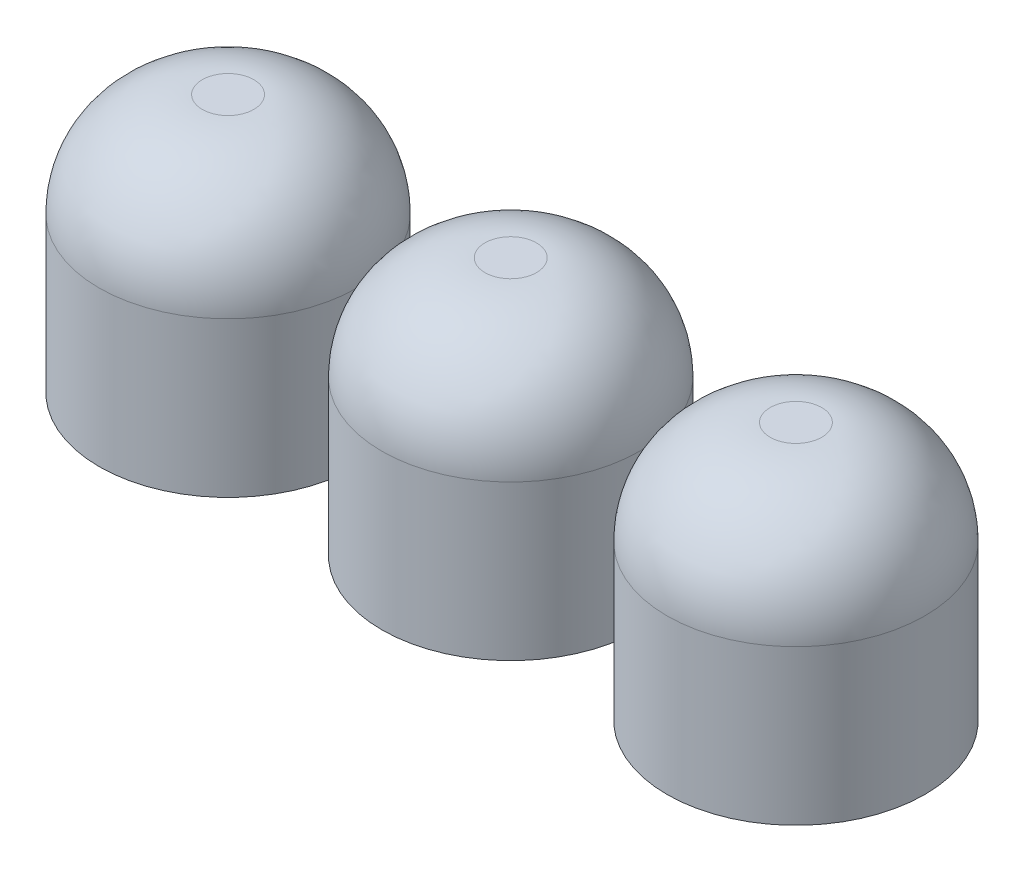
ISO-10303-21;
HEADER;
FILE_DESCRIPTION(('STEP AP214'),'2;1');
FILE_NAME('part.step','',(''),(''),'','','');
FILE_SCHEMA(('AUTOMOTIVE_DESIGN { 1 0 10303 214 1 1 1 1 }'));
ENDSEC;
DATA;
#1=APPLICATION_CONTEXT('core data for automotive mechanical design processes');
#2=APPLICATION_PROTOCOL_DEFINITION('international standard','automotive_design',2000,#1);
#3=PRODUCT_CONTEXT('',#1,'mechanical');
#4=PRODUCT('Part','Part','',(#3));
#5=PRODUCT_RELATED_PRODUCT_CATEGORY('part','',(#4));
#6=PRODUCT_DEFINITION_FORMATION('','',#4);
#7=PRODUCT_DEFINITION_CONTEXT('part definition',#1,'design');
#8=PRODUCT_DEFINITION('design','',#6,#7);
#9=PRODUCT_DEFINITION_SHAPE('','',#8);
#10=(LENGTH_UNIT() NAMED_UNIT(*) SI_UNIT(.MILLI.,.METRE.));
#11=(NAMED_UNIT(*) PLANE_ANGLE_UNIT() SI_UNIT($,.RADIAN.));
#12=(NAMED_UNIT(*) SI_UNIT($,.STERADIAN.) SOLID_ANGLE_UNIT());
#13=UNCERTAINTY_MEASURE_WITH_UNIT(LENGTH_MEASURE(1.E-05),#10,'distance_accuracy_value','');
#14=(GEOMETRIC_REPRESENTATION_CONTEXT(3) GLOBAL_UNCERTAINTY_ASSIGNED_CONTEXT((#13)) GLOBAL_UNIT_ASSIGNED_CONTEXT((#10,
#11,#12)) REPRESENTATION_CONTEXT('',''));
#15=CARTESIAN_POINT('',(0.,0.,0.));
#16=DIRECTION('',(0.,0.,1.));
#17=DIRECTION('',(1.,0.,0.));
#18=AXIS2_PLACEMENT_3D('',#15,#16,#17);
#19=CARTESIAN_POINT('',(-17.3040811056966,5.,-2.43677978773881));
#20=DIRECTION('',(0.,1.,0.));
#21=DIRECTION('',(0.,0.,1.));
#22=AXIS2_PLACEMENT_3D('',#19,#20,#21);
#23=PLANE('',#22);
#24=CARTESIAN_POINT('',(-17.3040811056966,5.,-2.43677978773881));
#25=DIRECTION('',(0.,1.,0.));
#26=DIRECTION('',(0.,0.,1.));
#27=AXIS2_PLACEMENT_3D('',#24,#25,#26);
#28=CIRCLE('',#27,0.5);
#29=CARTESIAN_POINT('',(-17.3040811056966,5.,-1.93677978773881));
#30=VERTEX_POINT('',#29);
#31=EDGE_CURVE('E52',#30,#30,#28,.T.);
#32=ORIENTED_EDGE('',*,*,#31,.T.);
#33=EDGE_LOOP('',(#32));
#34=FACE_BOUND('',#33,.T.);
#35=ADVANCED_FACE('F46',(#34),#23,.T.);
#36=CARTESIAN_POINT('',(-17.3040811056966,0.,-2.43677978773881));
#37=DIRECTION('',(0.,1.,0.));
#38=DIRECTION('',(0.,0.,1.));
#39=AXIS2_PLACEMENT_3D('',#36,#37,#38);
#40=PLANE('',#39);
#41=CARTESIAN_POINT('',(-17.3040811056966,0.,-2.43677978773881));
#42=DIRECTION('',(0.,-1.,0.));
#43=DIRECTION('',(0.,0.,-1.));
#44=AXIS2_PLACEMENT_3D('',#41,#42,#43);
#45=CIRCLE('',#44,2.05);
#46=CARTESIAN_POINT('',(-17.3040811056966,0.,-4.48677978773881));
#47=VERTEX_POINT('',#46);
#48=EDGE_CURVE('E63',#47,#47,#45,.T.);
#49=ORIENTED_EDGE('',*,*,#48,.F.);
#50=EDGE_LOOP('',(#49));
#51=FACE_BOUND('',#50,.T.);
#52=CARTESIAN_POINT('',(-17.3040811056966,0.,-2.43677978773881));
#53=DIRECTION('',(0.,1.,0.));
#54=DIRECTION('',(0.,0.,1.));
#55=AXIS2_PLACEMENT_3D('',#52,#53,#54);
#56=CIRCLE('',#55,2.5);
#57=CARTESIAN_POINT('',(-17.3040811056966,0.,0.0632202122611888));
#58=VERTEX_POINT('',#57);
#59=EDGE_CURVE('E60',#58,#58,#56,.T.);
#60=ORIENTED_EDGE('',*,*,#59,.F.);
#61=EDGE_LOOP('',(#60));
#62=FACE_BOUND('',#61,.T.);
#63=ADVANCED_FACE('F75',(#51,#62),#40,.F.);
#64=CARTESIAN_POINT('',(-17.3040811056966,5.,-2.43677978773881));
#65=DIRECTION('',(0.,-1.,0.));
#66=DIRECTION('',(0.,0.,-1.));
#67=AXIS2_PLACEMENT_3D('',#64,#65,#66);
#68=CYLINDRICAL_SURFACE('',#67,2.5);
#69=CARTESIAN_POINT('',(-17.3040811056966,3.,-2.43677978773881));
#70=DIRECTION('',(0.,1.,0.));
#71=DIRECTION('',(0.,0.,1.));
#72=AXIS2_PLACEMENT_3D('',#69,#70,#71);
#73=CIRCLE('',#72,2.5);
#74=CARTESIAN_POINT('',(-17.3040811056966,3.,0.0632202122611888));
#75=VERTEX_POINT('',#74);
#76=EDGE_CURVE('E11',#75,#75,#73,.F.);
#77=ORIENTED_EDGE('',*,*,#76,.T.);
#78=EDGE_LOOP('',(#77));
#79=FACE_BOUND('',#78,.T.);
#80=ORIENTED_EDGE('',*,*,#59,.T.);
#81=EDGE_LOOP('',(#80));
#82=FACE_BOUND('',#81,.T.);
#83=ADVANCED_FACE('F73',(#79,#82),#68,.T.);
#84=CARTESIAN_POINT('',(-17.3040811056966,4.,-2.43677978773881));
#85=DIRECTION('',(0.,-1.,0.));
#86=DIRECTION('',(0.,0.,-1.));
#87=AXIS2_PLACEMENT_3D('',#84,#85,#86);
#88=CYLINDRICAL_SURFACE('',#87,2.05);
#89=CARTESIAN_POINT('',(-17.3040811056966,4.,-2.43677978773881));
#90=DIRECTION('',(0.,-1.,0.));
#91=DIRECTION('',(0.,0.,-1.));
#92=AXIS2_PLACEMENT_3D('',#89,#90,#91);
#93=CIRCLE('',#92,2.05);
#94=CARTESIAN_POINT('',(-17.3040811056966,4.,-4.48677978773881));
#95=VERTEX_POINT('',#94);
#96=EDGE_CURVE('E65',#95,#95,#93,.T.);
#97=ORIENTED_EDGE('',*,*,#96,.F.);
#98=EDGE_LOOP('',(#97));
#99=FACE_BOUND('',#98,.T.);
#100=ORIENTED_EDGE('',*,*,#48,.T.);
#101=EDGE_LOOP('',(#100));
#102=FACE_BOUND('',#101,.T.);
#103=ADVANCED_FACE('F67',(#99,#102),#88,.F.);
#104=CARTESIAN_POINT('',(-17.3040811056966,4.,-2.43677978773881));
#105=DIRECTION('',(0.,-1.,0.));
#106=DIRECTION('',(0.,0.,-1.));
#107=AXIS2_PLACEMENT_3D('',#104,#105,#106);
#108=PLANE('',#107);
#109=ORIENTED_EDGE('',*,*,#96,.T.);
#110=EDGE_LOOP('',(#109));
#111=FACE_BOUND('',#110,.T.);
#112=ADVANCED_FACE('F88',(#111),#108,.T.);
#113=CARTESIAN_POINT('',(-17.3040811056966,3.,-2.43677978773881));
#114=DIRECTION('',(0.,1.,0.));
#115=DIRECTION('',(0.,0.,1.));
#116=AXIS2_PLACEMENT_3D('',#113,#114,#115);
#117=DEGENERATE_TOROIDAL_SURFACE('',#116,0.5,2.,.T.);
#118=ORIENTED_EDGE('',*,*,#76,.F.);
#119=EDGE_LOOP('',(#118));
#120=FACE_BOUND('',#119,.T.);
#121=ORIENTED_EDGE('',*,*,#31,.F.);
#122=EDGE_LOOP('',(#121));
#123=FACE_BOUND('',#122,.T.);
#124=ADVANCED_FACE('F48',(#120,#123),#117,.T.);
#125=CLOSED_SHELL('',(#35,#63,#83,#103,#112,#124));
#126=MANIFOLD_SOLID_BREP('B2',#125);
#127=CARTESIAN_POINT('',(-22.8359209812905,5.,-2.43677978773881));
#128=DIRECTION('',(0.,1.,0.));
#129=DIRECTION('',(0.,0.,1.));
#130=AXIS2_PLACEMENT_3D('',#127,#128,#129);
#131=PLANE('',#130);
#132=CARTESIAN_POINT('',(-22.8359209812905,5.,-2.43677978773881));
#133=DIRECTION('',(0.,1.,0.));
#134=DIRECTION('',(0.,0.,1.));
#135=AXIS2_PLACEMENT_3D('',#132,#133,#134);
#136=CIRCLE('',#135,0.500000000000002);
#137=CARTESIAN_POINT('',(-22.8359209812905,5.,-1.93677978773881));
#138=VERTEX_POINT('',#137);
#139=EDGE_CURVE('E155',#138,#138,#136,.T.);
#140=ORIENTED_EDGE('',*,*,#139,.T.);
#141=EDGE_LOOP('',(#140));
#142=FACE_BOUND('',#141,.T.);
#143=ADVANCED_FACE('F144',(#142),#131,.T.);
#144=CARTESIAN_POINT('',(-22.8359209812905,0.,-2.43677978773881));
#145=DIRECTION('',(0.,1.,0.));
#146=DIRECTION('',(0.,0.,1.));
#147=AXIS2_PLACEMENT_3D('',#144,#145,#146);
#148=PLANE('',#147);
#149=CARTESIAN_POINT('',(-22.8359209812905,0.,-2.43677978773881));
#150=DIRECTION('',(0.,-1.,0.));
#151=DIRECTION('',(0.,0.,-1.));
#152=AXIS2_PLACEMENT_3D('',#149,#150,#151);
#153=CIRCLE('',#152,2.05);
#154=CARTESIAN_POINT('',(-22.8359209812905,0.,-4.48677978773881));
#155=VERTEX_POINT('',#154);
#156=EDGE_CURVE('E159',#155,#155,#153,.T.);
#157=ORIENTED_EDGE('',*,*,#156,.F.);
#158=EDGE_LOOP('',(#157));
#159=FACE_BOUND('',#158,.T.);
#160=CARTESIAN_POINT('',(-22.8359209812905,0.,-2.43677978773881));
#161=DIRECTION('',(0.,1.,0.));
#162=DIRECTION('',(0.,0.,1.));
#163=AXIS2_PLACEMENT_3D('',#160,#161,#162);
#164=CIRCLE('',#163,2.5);
#165=CARTESIAN_POINT('',(-22.8359209812905,0.,0.0632202122611905));
#166=VERTEX_POINT('',#165);
#167=EDGE_CURVE('E156',#166,#166,#164,.T.);
#168=ORIENTED_EDGE('',*,*,#167,.F.);
#169=EDGE_LOOP('',(#168));
#170=FACE_BOUND('',#169,.T.);
#171=ADVANCED_FACE('F173',(#159,#170),#148,.F.);
#172=CARTESIAN_POINT('',(-22.8359209812905,5.,-2.43677978773881));
#173=DIRECTION('',(0.,-1.,0.));
#174=DIRECTION('',(0.,0.,-1.));
#175=AXIS2_PLACEMENT_3D('',#172,#173,#174);
#176=CYLINDRICAL_SURFACE('',#175,2.5);
#177=CARTESIAN_POINT('',(-22.8359209812905,3.,-2.43677978773881));
#178=DIRECTION('',(0.,1.,0.));
#179=DIRECTION('',(0.,0.,1.));
#180=AXIS2_PLACEMENT_3D('',#177,#178,#179);
#181=CIRCLE('',#180,2.5);
#182=CARTESIAN_POINT('',(-22.8359209812905,3.,0.0632202122611905));
#183=VERTEX_POINT('',#182);
#184=EDGE_CURVE('E44',#183,#183,#181,.F.);
#185=ORIENTED_EDGE('',*,*,#184,.T.);
#186=EDGE_LOOP('',(#185));
#187=FACE_BOUND('',#186,.T.);
#188=ORIENTED_EDGE('',*,*,#167,.T.);
#189=EDGE_LOOP('',(#188));
#190=FACE_BOUND('',#189,.T.);
#191=ADVANCED_FACE('F175',(#187,#190),#176,.T.);
#192=CARTESIAN_POINT('',(-22.8359209812905,4.,-2.43677978773881));
#193=DIRECTION('',(0.,-1.,0.));
#194=DIRECTION('',(0.,0.,-1.));
#195=AXIS2_PLACEMENT_3D('',#192,#193,#194);
#196=CYLINDRICAL_SURFACE('',#195,2.05);
#197=CARTESIAN_POINT('',(-22.8359209812905,4.,-2.43677978773881));
#198=DIRECTION('',(0.,-1.,0.));
#199=DIRECTION('',(0.,0.,-1.));
#200=AXIS2_PLACEMENT_3D('',#197,#198,#199);
#201=CIRCLE('',#200,2.05);
#202=CARTESIAN_POINT('',(-22.8359209812905,4.,-4.48677978773881));
#203=VERTEX_POINT('',#202);
#204=EDGE_CURVE('E162',#203,#203,#201,.T.);
#205=ORIENTED_EDGE('',*,*,#204,.F.);
#206=EDGE_LOOP('',(#205));
#207=FACE_BOUND('',#206,.T.);
#208=ORIENTED_EDGE('',*,*,#156,.T.);
#209=EDGE_LOOP('',(#208));
#210=FACE_BOUND('',#209,.T.);
#211=ADVANCED_FACE('F166',(#207,#210),#196,.F.);
#212=CARTESIAN_POINT('',(-22.8359209812905,4.,-2.43677978773881));
#213=DIRECTION('',(0.,-1.,0.));
#214=DIRECTION('',(0.,0.,-1.));
#215=AXIS2_PLACEMENT_3D('',#212,#213,#214);
#216=PLANE('',#215);
#217=ORIENTED_EDGE('',*,*,#204,.T.);
#218=EDGE_LOOP('',(#217));
#219=FACE_BOUND('',#218,.T.);
#220=ADVANCED_FACE('F183',(#219),#216,.T.);
#221=CARTESIAN_POINT('',(-22.8359209812905,3.,-2.43677978773881));
#222=DIRECTION('',(0.,1.,0.));
#223=DIRECTION('',(0.,0.,1.));
#224=AXIS2_PLACEMENT_3D('',#221,#222,#223);
#225=DEGENERATE_TOROIDAL_SURFACE('',#224,0.500000000000002,2.,.T.);
#226=ORIENTED_EDGE('',*,*,#184,.F.);
#227=EDGE_LOOP('',(#226));
#228=FACE_BOUND('',#227,.T.);
#229=ORIENTED_EDGE('',*,*,#139,.F.);
#230=EDGE_LOOP('',(#229));
#231=FACE_BOUND('',#230,.T.);
#232=ADVANCED_FACE('F150',(#228,#231),#225,.T.);
#233=CLOSED_SHELL('',(#143,#171,#191,#211,#220,#232));
#234=MANIFOLD_SOLID_BREP('B6',#233);
#235=CARTESIAN_POINT('',(-28.3180804742213,5.,-2.43677978773881));
#236=DIRECTION('',(0.,1.,0.));
#237=DIRECTION('',(0.,0.,1.));
#238=AXIS2_PLACEMENT_3D('',#235,#236,#237);
#239=PLANE('',#238);
#240=CARTESIAN_POINT('',(-28.3180804742213,5.,-2.43677978773881));
#241=DIRECTION('',(0.,1.,0.));
#242=DIRECTION('',(0.,0.,1.));
#243=AXIS2_PLACEMENT_3D('',#240,#241,#242);
#244=CIRCLE('',#243,0.499999999999999);
#245=CARTESIAN_POINT('',(-28.3180804742213,5.,-1.93677978773881));
#246=VERTEX_POINT('',#245);
#247=EDGE_CURVE('E245',#246,#246,#244,.T.);
#248=ORIENTED_EDGE('',*,*,#247,.T.);
#249=EDGE_LOOP('',(#248));
#250=FACE_BOUND('',#249,.T.);
#251=ADVANCED_FACE('F240',(#250),#239,.T.);
#252=CARTESIAN_POINT('',(-28.3180804742213,0.,-2.43677978773881));
#253=DIRECTION('',(0.,1.,0.));
#254=DIRECTION('',(0.,0.,1.));
#255=AXIS2_PLACEMENT_3D('',#252,#253,#254);
#256=PLANE('',#255);
#257=CARTESIAN_POINT('',(-28.3180804742213,0.,-2.43677978773881));
#258=DIRECTION('',(0.,-1.,0.));
#259=DIRECTION('',(0.,0.,-1.));
#260=AXIS2_PLACEMENT_3D('',#257,#258,#259);
#261=CIRCLE('',#260,2.05);
#262=CARTESIAN_POINT('',(-28.3180804742213,0.,-4.48677978773881));
#263=VERTEX_POINT('',#262);
#264=EDGE_CURVE('E254',#263,#263,#261,.T.);
#265=ORIENTED_EDGE('',*,*,#264,.F.);
#266=EDGE_LOOP('',(#265));
#267=FACE_BOUND('',#266,.T.);
#268=CARTESIAN_POINT('',(-28.3180804742213,0.,-2.43677978773881));
#269=DIRECTION('',(0.,1.,0.));
#270=DIRECTION('',(0.,0.,1.));
#271=AXIS2_PLACEMENT_3D('',#268,#269,#270);
#272=CIRCLE('',#271,2.5);
#273=CARTESIAN_POINT('',(-28.3180804742213,0.,0.063220212261187));
#274=VERTEX_POINT('',#273);
#275=EDGE_CURVE('E248',#274,#274,#272,.T.);
#276=ORIENTED_EDGE('',*,*,#275,.F.);
#277=EDGE_LOOP('',(#276));
#278=FACE_BOUND('',#277,.T.);
#279=ADVANCED_FACE('F269',(#267,#278),#256,.F.);
#280=CARTESIAN_POINT('',(-28.3180804742213,5.,-2.43677978773881));
#281=DIRECTION('',(0.,-1.,0.));
#282=DIRECTION('',(0.,0.,-1.));
#283=AXIS2_PLACEMENT_3D('',#280,#281,#282);
#284=CYLINDRICAL_SURFACE('',#283,2.5);
#285=CARTESIAN_POINT('',(-28.3180804742213,3.,-2.43677978773881));
#286=DIRECTION('',(0.,1.,0.));
#287=DIRECTION('',(0.,0.,1.));
#288=AXIS2_PLACEMENT_3D('',#285,#286,#287);
#289=CIRCLE('',#288,2.5);
#290=CARTESIAN_POINT('',(-28.3180804742213,3.,0.063220212261187));
#291=VERTEX_POINT('',#290);
#292=EDGE_CURVE('E145',#291,#291,#289,.F.);
#293=ORIENTED_EDGE('',*,*,#292,.T.);
#294=EDGE_LOOP('',(#293));
#295=FACE_BOUND('',#294,.T.);
#296=ORIENTED_EDGE('',*,*,#275,.T.);
#297=EDGE_LOOP('',(#296));
#298=FACE_BOUND('',#297,.T.);
#299=ADVANCED_FACE('F266',(#295,#298),#284,.T.);
#300=CARTESIAN_POINT('',(-28.3180804742213,4.,-2.43677978773881));
#301=DIRECTION('',(0.,-1.,0.));
#302=DIRECTION('',(0.,0.,-1.));
#303=AXIS2_PLACEMENT_3D('',#300,#301,#302);
#304=CYLINDRICAL_SURFACE('',#303,2.05);
#305=CARTESIAN_POINT('',(-28.3180804742213,4.,-2.43677978773881));
#306=DIRECTION('',(0.,-1.,0.));
#307=DIRECTION('',(0.,0.,-1.));
#308=AXIS2_PLACEMENT_3D('',#305,#306,#307);
#309=CIRCLE('',#308,2.05);
#310=CARTESIAN_POINT('',(-28.3180804742213,4.,-4.48677978773881));
#311=VERTEX_POINT('',#310);
#312=EDGE_CURVE('E252',#311,#311,#309,.T.);
#313=ORIENTED_EDGE('',*,*,#312,.F.);
#314=EDGE_LOOP('',(#313));
#315=FACE_BOUND('',#314,.T.);
#316=ORIENTED_EDGE('',*,*,#264,.T.);
#317=EDGE_LOOP('',(#316));
#318=FACE_BOUND('',#317,.T.);
#319=ADVANCED_FACE('F263',(#315,#318),#304,.F.);
#320=CARTESIAN_POINT('',(-28.3180804742213,4.,-2.43677978773881));
#321=DIRECTION('',(0.,-1.,0.));
#322=DIRECTION('',(0.,0.,-1.));
#323=AXIS2_PLACEMENT_3D('',#320,#321,#322);
#324=PLANE('',#323);
#325=ORIENTED_EDGE('',*,*,#312,.T.);
#326=EDGE_LOOP('',(#325));
#327=FACE_BOUND('',#326,.T.);
#328=ADVANCED_FACE('F261',(#327),#324,.T.);
#329=CARTESIAN_POINT('',(-28.3180804742213,3.,-2.43677978773881));
#330=DIRECTION('',(0.,1.,0.));
#331=DIRECTION('',(0.,0.,1.));
#332=AXIS2_PLACEMENT_3D('',#329,#330,#331);
#333=DEGENERATE_TOROIDAL_SURFACE('',#332,0.499999999999999,2.,.T.);
#334=ORIENTED_EDGE('',*,*,#292,.F.);
#335=EDGE_LOOP('',(#334));
#336=FACE_BOUND('',#335,.T.);
#337=ORIENTED_EDGE('',*,*,#247,.F.);
#338=EDGE_LOOP('',(#337));
#339=FACE_BOUND('',#338,.T.);
#340=ADVANCED_FACE('F239',(#336,#339),#333,.T.);
#341=CLOSED_SHELL('',(#251,#279,#299,#319,#328,#340));
#342=MANIFOLD_SOLID_BREP('B37',#341);
#343=ADVANCED_BREP_SHAPE_REPRESENTATION('',(#18,#126,#234,#342),#14);
#344=SHAPE_DEFINITION_REPRESENTATION(#9,#343);
ENDSEC;
END-ISO-10303-21;
